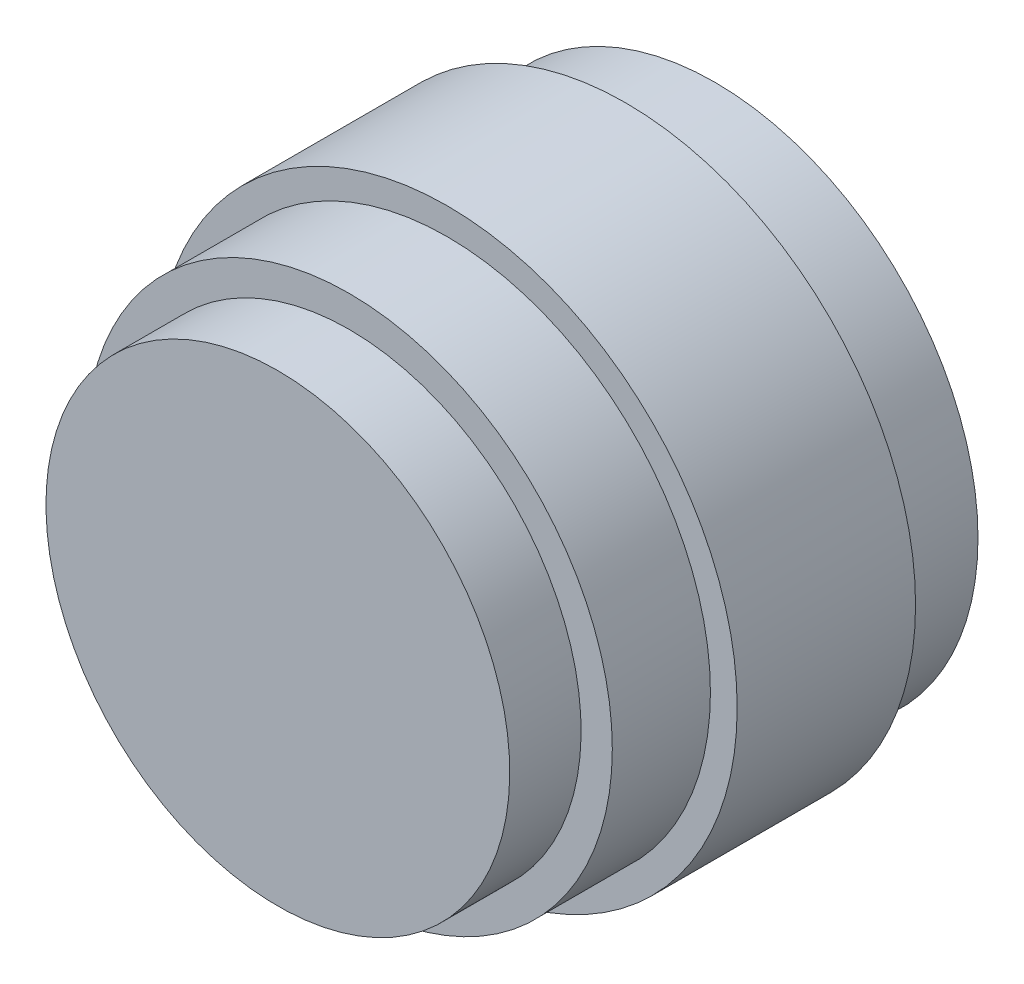
ISO-10303-21;
HEADER;
FILE_DESCRIPTION(('STEP AP214'),'2;1');
FILE_NAME('part.step','',(''),(''),'','','');
FILE_SCHEMA(('AUTOMOTIVE_DESIGN { 1 0 10303 214 1 1 1 1 }'));
ENDSEC;
DATA;
#1=APPLICATION_CONTEXT('core data for automotive mechanical design processes');
#2=APPLICATION_PROTOCOL_DEFINITION('international standard','automotive_design',2000,#1);
#3=PRODUCT_CONTEXT('',#1,'mechanical');
#4=PRODUCT('Part','Part','',(#3));
#5=PRODUCT_RELATED_PRODUCT_CATEGORY('part','',(#4));
#6=PRODUCT_DEFINITION_FORMATION('','',#4);
#7=PRODUCT_DEFINITION_CONTEXT('part definition',#1,'design');
#8=PRODUCT_DEFINITION('design','',#6,#7);
#9=PRODUCT_DEFINITION_SHAPE('','',#8);
#10=(LENGTH_UNIT() NAMED_UNIT(*) SI_UNIT(.MILLI.,.METRE.));
#11=(NAMED_UNIT(*) PLANE_ANGLE_UNIT() SI_UNIT($,.RADIAN.));
#12=(NAMED_UNIT(*) SI_UNIT($,.STERADIAN.) SOLID_ANGLE_UNIT());
#13=UNCERTAINTY_MEASURE_WITH_UNIT(LENGTH_MEASURE(1.E-05),#10,'distance_accuracy_value','');
#14=(GEOMETRIC_REPRESENTATION_CONTEXT(3) GLOBAL_UNCERTAINTY_ASSIGNED_CONTEXT((#13)) GLOBAL_UNIT_ASSIGNED_CONTEXT((#10,
#11,#12)) REPRESENTATION_CONTEXT('',''));
#15=CARTESIAN_POINT('',(0.,0.,0.));
#16=DIRECTION('',(0.,0.,1.));
#17=DIRECTION('',(1.,0.,0.));
#18=AXIS2_PLACEMENT_3D('',#15,#16,#17);
#19=CARTESIAN_POINT('',(0.,0.,0.));
#20=DIRECTION('',(0.,0.,-1.));
#21=DIRECTION('',(0.,1.,0.));
#22=AXIS2_PLACEMENT_3D('',#19,#20,#21);
#23=PLANE('',#22);
#24=CARTESIAN_POINT('',(0.,0.,0.));
#25=DIRECTION('',(0.,0.,-1.));
#26=DIRECTION('',(0.,1.,0.));
#27=AXIS2_PLACEMENT_3D('',#24,#25,#26);
#28=CIRCLE('',#27,29.5);
#29=CARTESIAN_POINT('',(0.,29.5,0.));
#30=VERTEX_POINT('',#29);
#31=EDGE_CURVE('E10',#30,#30,#28,.T.);
#32=ORIENTED_EDGE('',*,*,#31,.T.);
#33=EDGE_LOOP('',(#32));
#34=FACE_BOUND('',#33,.T.);
#35=ADVANCED_FACE('F30',(#34),#23,.T.);
#36=CARTESIAN_POINT('',(0.,0.,0.));
#37=DIRECTION('',(0.,0.,-1.));
#38=DIRECTION('',(0.,1.,0.));
#39=AXIS2_PLACEMENT_3D('',#36,#37,#38);
#40=CYLINDRICAL_SURFACE('',#39,29.5);
#41=CARTESIAN_POINT('',(0.,0.,10.));
#42=DIRECTION('',(0.,0.,-1.));
#43=DIRECTION('',(0.,1.,0.));
#44=AXIS2_PLACEMENT_3D('',#41,#42,#43);
#45=CIRCLE('',#44,29.5);
#46=CARTESIAN_POINT('',(0.,29.5,10.));
#47=VERTEX_POINT('',#46);
#48=EDGE_CURVE('E36',#47,#47,#45,.T.);
#49=ORIENTED_EDGE('',*,*,#48,.T.);
#50=EDGE_LOOP('',(#49));
#51=FACE_BOUND('',#50,.T.);
#52=ORIENTED_EDGE('',*,*,#31,.F.);
#53=EDGE_LOOP('',(#52));
#54=FACE_BOUND('',#53,.T.);
#55=ADVANCED_FACE('F74',(#51,#54),#40,.T.);
#56=CARTESIAN_POINT('',(0.,29.5,10.));
#57=DIRECTION('',(0.,0.,-1.));
#58=DIRECTION('',(0.,1.,0.));
#59=AXIS2_PLACEMENT_3D('',#56,#57,#58);
#60=PLANE('',#59);
#61=CARTESIAN_POINT('',(0.,0.,10.));
#62=DIRECTION('',(0.,0.,-1.));
#63=DIRECTION('',(0.,1.,0.));
#64=AXIS2_PLACEMENT_3D('',#61,#62,#63);
#65=CIRCLE('',#64,32.5);
#66=CARTESIAN_POINT('',(0.,32.5,10.));
#67=VERTEX_POINT('',#66);
#68=EDGE_CURVE('E40',#67,#67,#65,.T.);
#69=ORIENTED_EDGE('',*,*,#68,.T.);
#70=EDGE_LOOP('',(#69));
#71=FACE_BOUND('',#70,.T.);
#72=ORIENTED_EDGE('',*,*,#48,.F.);
#73=EDGE_LOOP('',(#72));
#74=FACE_BOUND('',#73,.T.);
#75=ADVANCED_FACE('F78',(#71,#74),#60,.T.);
#76=CARTESIAN_POINT('',(0.,0.,0.));
#77=DIRECTION('',(0.,0.,-1.));
#78=DIRECTION('',(0.,1.,0.));
#79=AXIS2_PLACEMENT_3D('',#76,#77,#78);
#80=CYLINDRICAL_SURFACE('',#79,32.5);
#81=CARTESIAN_POINT('',(0.,0.,30.));
#82=DIRECTION('',(0.,0.,-1.));
#83=DIRECTION('',(0.,1.,0.));
#84=AXIS2_PLACEMENT_3D('',#81,#82,#83);
#85=CIRCLE('',#84,32.5);
#86=CARTESIAN_POINT('',(0.,32.5,30.));
#87=VERTEX_POINT('',#86);
#88=EDGE_CURVE('E44',#87,#87,#85,.T.);
#89=ORIENTED_EDGE('',*,*,#88,.T.);
#90=EDGE_LOOP('',(#89));
#91=FACE_BOUND('',#90,.T.);
#92=ORIENTED_EDGE('',*,*,#68,.F.);
#93=EDGE_LOOP('',(#92));
#94=FACE_BOUND('',#93,.T.);
#95=ADVANCED_FACE('F82',(#91,#94),#80,.T.);
#96=CARTESIAN_POINT('',(0.,29.5,30.));
#97=DIRECTION('',(0.,0.,1.));
#98=DIRECTION('',(0.,-1.,0.));
#99=AXIS2_PLACEMENT_3D('',#96,#97,#98);
#100=PLANE('',#99);
#101=CARTESIAN_POINT('',(0.,0.,30.));
#102=DIRECTION('',(0.,0.,-1.));
#103=DIRECTION('',(0.,1.,0.));
#104=AXIS2_PLACEMENT_3D('',#101,#102,#103);
#105=CIRCLE('',#104,29.5);
#106=CARTESIAN_POINT('',(0.,29.5,30.));
#107=VERTEX_POINT('',#106);
#108=EDGE_CURVE('E49',#107,#107,#105,.T.);
#109=ORIENTED_EDGE('',*,*,#108,.T.);
#110=EDGE_LOOP('',(#109));
#111=FACE_BOUND('',#110,.T.);
#112=ORIENTED_EDGE('',*,*,#88,.F.);
#113=EDGE_LOOP('',(#112));
#114=FACE_BOUND('',#113,.T.);
#115=ADVANCED_FACE('F89',(#111,#114),#100,.T.);
#116=CARTESIAN_POINT('',(0.,0.,0.));
#117=DIRECTION('',(0.,0.,-1.));
#118=DIRECTION('',(0.,1.,0.));
#119=AXIS2_PLACEMENT_3D('',#116,#117,#118);
#120=CYLINDRICAL_SURFACE('',#119,29.5);
#121=CARTESIAN_POINT('',(0.,0.,41.));
#122=DIRECTION('',(0.,0.,-1.));
#123=DIRECTION('',(0.,1.,0.));
#124=AXIS2_PLACEMENT_3D('',#121,#122,#123);
#125=CIRCLE('',#124,29.5);
#126=CARTESIAN_POINT('',(0.,29.5,41.));
#127=VERTEX_POINT('',#126);
#128=EDGE_CURVE('E52',#127,#127,#125,.T.);
#129=ORIENTED_EDGE('',*,*,#128,.T.);
#130=EDGE_LOOP('',(#129));
#131=FACE_BOUND('',#130,.T.);
#132=ORIENTED_EDGE('',*,*,#108,.F.);
#133=EDGE_LOOP('',(#132));
#134=FACE_BOUND('',#133,.T.);
#135=ADVANCED_FACE('F93',(#131,#134),#120,.T.);
#136=CARTESIAN_POINT('',(0.,29.5,41.));
#137=DIRECTION('',(0.,0.,1.));
#138=DIRECTION('',(0.,-1.,0.));
#139=AXIS2_PLACEMENT_3D('',#136,#137,#138);
#140=PLANE('',#139);
#141=CARTESIAN_POINT('',(0.,0.,41.));
#142=DIRECTION('',(0.,0.,-1.));
#143=DIRECTION('',(0.,1.,0.));
#144=AXIS2_PLACEMENT_3D('',#141,#142,#143);
#145=CIRCLE('',#144,26.);
#146=CARTESIAN_POINT('',(0.,26.,41.));
#147=VERTEX_POINT('',#146);
#148=EDGE_CURVE('E55',#147,#147,#145,.T.);
#149=ORIENTED_EDGE('',*,*,#148,.T.);
#150=EDGE_LOOP('',(#149));
#151=FACE_BOUND('',#150,.T.);
#152=ORIENTED_EDGE('',*,*,#128,.F.);
#153=EDGE_LOOP('',(#152));
#154=FACE_BOUND('',#153,.T.);
#155=ADVANCED_FACE('F71',(#151,#154),#140,.T.);
#156=CARTESIAN_POINT('',(0.,0.,0.));
#157=DIRECTION('',(0.,0.,-1.));
#158=DIRECTION('',(0.,1.,0.));
#159=AXIS2_PLACEMENT_3D('',#156,#157,#158);
#160=CYLINDRICAL_SURFACE('',#159,26.);
#161=CARTESIAN_POINT('',(0.,0.,49.));
#162=DIRECTION('',(0.,0.,-1.));
#163=DIRECTION('',(0.,1.,0.));
#164=AXIS2_PLACEMENT_3D('',#161,#162,#163);
#165=CIRCLE('',#164,26.);
#166=CARTESIAN_POINT('',(0.,26.,49.));
#167=VERTEX_POINT('',#166);
#168=EDGE_CURVE('E58',#167,#167,#165,.T.);
#169=ORIENTED_EDGE('',*,*,#168,.T.);
#170=EDGE_LOOP('',(#169));
#171=FACE_BOUND('',#170,.T.);
#172=ORIENTED_EDGE('',*,*,#148,.F.);
#173=EDGE_LOOP('',(#172));
#174=FACE_BOUND('',#173,.T.);
#175=ADVANCED_FACE('F62',(#171,#174),#160,.T.);
#176=CARTESIAN_POINT('',(0.,0.,49.));
#177=DIRECTION('',(0.,0.,1.));
#178=DIRECTION('',(0.,-1.,0.));
#179=AXIS2_PLACEMENT_3D('',#176,#177,#178);
#180=PLANE('',#179);
#181=ORIENTED_EDGE('',*,*,#168,.F.);
#182=EDGE_LOOP('',(#181));
#183=FACE_BOUND('',#182,.T.);
#184=ADVANCED_FACE('F65',(#183),#180,.T.);
#185=CLOSED_SHELL('',(#35,#55,#75,#95,#115,#135,#155,#175,#184));
#186=MANIFOLD_SOLID_BREP('B2',#185);
#187=ADVANCED_BREP_SHAPE_REPRESENTATION('',(#18,#186),#14);
#188=SHAPE_DEFINITION_REPRESENTATION(#9,#187);
ENDSEC;
END-ISO-10303-21;
